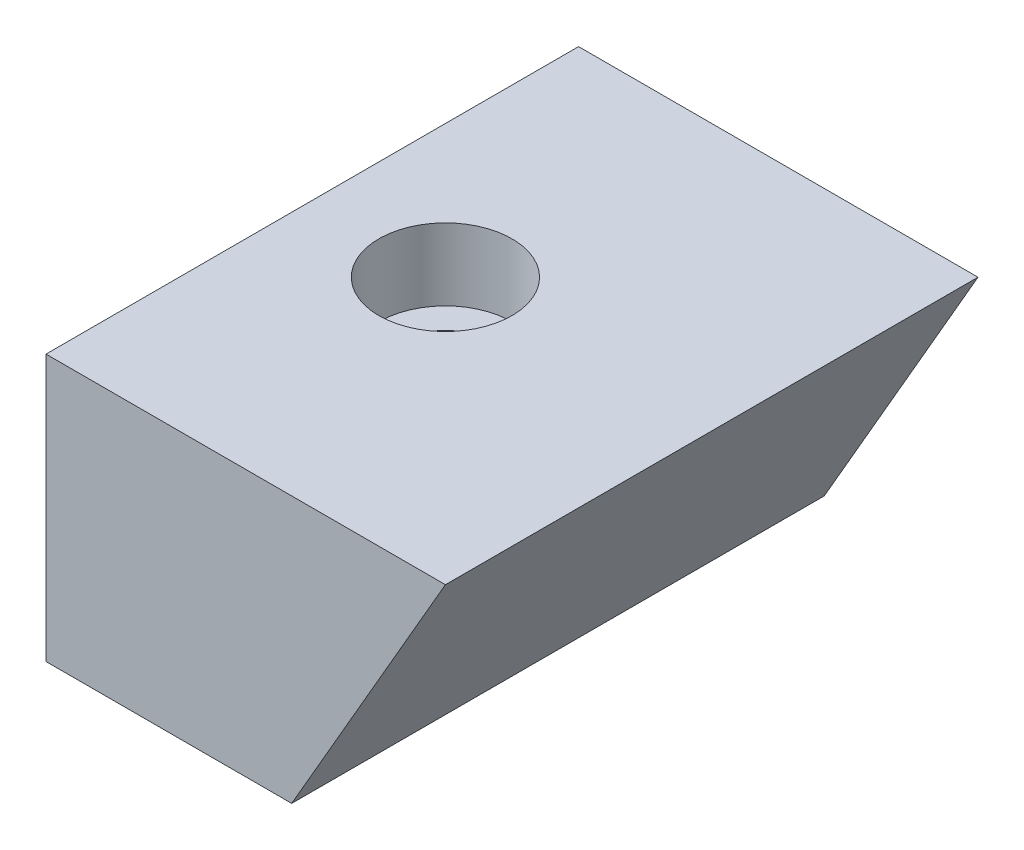
ISO-10303-21;
HEADER;
FILE_DESCRIPTION(('STEP AP214'),'2;1');
FILE_NAME('part.step','',(''),(''),'','','');
FILE_SCHEMA(('AUTOMOTIVE_DESIGN { 1 0 10303 214 1 1 1 1 }'));
ENDSEC;
DATA;
#1=APPLICATION_CONTEXT('core data for automotive mechanical design processes');
#2=APPLICATION_PROTOCOL_DEFINITION('international standard','automotive_design',2000,#1);
#3=PRODUCT_CONTEXT('',#1,'mechanical');
#4=PRODUCT('Part','Part','',(#3));
#5=PRODUCT_RELATED_PRODUCT_CATEGORY('part','',(#4));
#6=PRODUCT_DEFINITION_FORMATION('','',#4);
#7=PRODUCT_DEFINITION_CONTEXT('part definition',#1,'design');
#8=PRODUCT_DEFINITION('design','',#6,#7);
#9=PRODUCT_DEFINITION_SHAPE('','',#8);
#10=(LENGTH_UNIT() NAMED_UNIT(*) SI_UNIT(.MILLI.,.METRE.));
#11=(NAMED_UNIT(*) PLANE_ANGLE_UNIT() SI_UNIT($,.RADIAN.));
#12=(NAMED_UNIT(*) SI_UNIT($,.STERADIAN.) SOLID_ANGLE_UNIT());
#13=UNCERTAINTY_MEASURE_WITH_UNIT(LENGTH_MEASURE(1.E-05),#10,'distance_accuracy_value','');
#14=(GEOMETRIC_REPRESENTATION_CONTEXT(3) GLOBAL_UNCERTAINTY_ASSIGNED_CONTEXT((#13)) GLOBAL_UNIT_ASSIGNED_CONTEXT((#10,
#11,#12)) REPRESENTATION_CONTEXT('',''));
#15=CARTESIAN_POINT('',(0.,0.,0.));
#16=DIRECTION('',(0.,0.,1.));
#17=DIRECTION('',(1.,0.,0.));
#18=AXIS2_PLACEMENT_3D('',#15,#16,#17);
#19=CARTESIAN_POINT('',(-10.0000000000117,20.6911673232573,40.));
#20=DIRECTION('',(1.,0.,0.));
#21=DIRECTION('',(0.,0.,-1.));
#22=AXIS2_PLACEMENT_3D('',#19,#20,#21);
#23=PLANE('',#22);
#24=DIRECTION('',(0.,-1.,0.));
#25=VECTOR('',#24,1.);
#26=CARTESIAN_POINT('',(-10.0000000000117,20.6911673232573,0.));
#27=LINE('',#26,#25);
#28=CARTESIAN_POINT('',(-10.0000000000117,20.6911673232573,0.));
#29=VERTEX_POINT('',#28);
#30=CARTESIAN_POINT('',(-10.0000000000117,0.691167323257264,0.));
#31=VERTEX_POINT('',#30);
#32=EDGE_CURVE('E95',#29,#31,#27,.T.);
#33=ORIENTED_EDGE('',*,*,#32,.T.);
#34=DIRECTION('',(0.,0.,-1.));
#35=VECTOR('',#34,1.);
#36=CARTESIAN_POINT('',(-10.0000000000117,0.691167323257264,40.));
#37=LINE('',#36,#35);
#38=CARTESIAN_POINT('',(-10.0000000000117,0.691167323257264,40.));
#39=VERTEX_POINT('',#38);
#40=EDGE_CURVE('E11',#39,#31,#37,.T.);
#41=ORIENTED_EDGE('',*,*,#40,.F.);
#42=DIRECTION('',(0.,-1.,0.));
#43=VECTOR('',#42,1.);
#44=CARTESIAN_POINT('',(-10.0000000000117,20.6911673232573,40.));
#45=LINE('',#44,#43);
#46=CARTESIAN_POINT('',(-10.0000000000117,20.6911673232573,40.));
#47=VERTEX_POINT('',#46);
#48=EDGE_CURVE('E83',#47,#39,#45,.T.);
#49=ORIENTED_EDGE('',*,*,#48,.F.);
#50=DIRECTION('',(0.,0.,-1.));
#51=VECTOR('',#50,1.);
#52=CARTESIAN_POINT('',(-10.0000000000117,20.6911673232573,40.));
#53=LINE('',#52,#51);
#54=EDGE_CURVE('E91',#47,#29,#53,.T.);
#55=ORIENTED_EDGE('',*,*,#54,.T.);
#56=EDGE_LOOP('',(#33,#41,#49,#55));
#57=FACE_BOUND('',#56,.T.);
#58=ADVANCED_FACE('F32',(#57),#23,.F.);
#59=CARTESIAN_POINT('',(-10.0000000000117,0.691167323257264,40.));
#60=DIRECTION('',(0.,1.,0.));
#61=DIRECTION('',(-1.,0.,0.));
#62=AXIS2_PLACEMENT_3D('',#59,#60,#61);
#63=PLANE('',#62);
#64=CARTESIAN_POINT('',(-1.16579199997228E-11,0.691167323257261,20.));
#65=DIRECTION('',(0.,1.,0.));
#66=DIRECTION('',(0.,0.,1.));
#67=AXIS2_PLACEMENT_3D('',#64,#65,#66);
#68=CIRCLE('',#67,2.75);
#69=CARTESIAN_POINT('',(-1.16579199997228E-11,0.691167323257261,22.75));
#70=VERTEX_POINT('',#69);
#71=EDGE_CURVE('E98',#70,#70,#68,.T.);
#72=ORIENTED_EDGE('',*,*,#71,.T.);
#73=EDGE_LOOP('',(#72));
#74=FACE_BOUND('',#73,.T.);
#75=DIRECTION('',(1.,0.,0.));
#76=VECTOR('',#75,1.);
#77=CARTESIAN_POINT('',(-10.0000000000117,0.691167323257264,0.));
#78=LINE('',#77,#76);
#79=CARTESIAN_POINT('',(8.45299461619571,0.691167323257266,0.));
#80=VERTEX_POINT('',#79);
#81=EDGE_CURVE('E87',#31,#80,#78,.T.);
#82=ORIENTED_EDGE('',*,*,#81,.T.);
#83=DIRECTION('',(0.,0.,-1.));
#84=VECTOR('',#83,1.);
#85=CARTESIAN_POINT('',(8.45299461619571,0.691167323257266,40.));
#86=LINE('',#85,#84);
#87=CARTESIAN_POINT('',(8.45299461619571,0.691167323257266,40.));
#88=VERTEX_POINT('',#87);
#89=EDGE_CURVE('E40',#88,#80,#86,.T.);
#90=ORIENTED_EDGE('',*,*,#89,.F.);
#91=DIRECTION('',(1.,0.,0.));
#92=VECTOR('',#91,1.);
#93=CARTESIAN_POINT('',(-10.0000000000117,0.691167323257264,40.));
#94=LINE('',#93,#92);
#95=EDGE_CURVE('E78',#39,#88,#94,.T.);
#96=ORIENTED_EDGE('',*,*,#95,.F.);
#97=ORIENTED_EDGE('',*,*,#40,.T.);
#98=EDGE_LOOP('',(#82,#90,#96,#97));
#99=FACE_BOUND('',#98,.T.);
#100=ADVANCED_FACE('F86',(#74,#99),#63,.F.);
#101=CARTESIAN_POINT('',(8.45299461619571,0.691167323257266,40.));
#102=DIRECTION('',(-0.866025403784436,0.500000000000004,0.));
#103=DIRECTION('',(-0.500000000000004,-0.866025403784436,0.));
#104=AXIS2_PLACEMENT_3D('',#101,#102,#103);
#105=PLANE('',#104);
#106=DIRECTION('',(0.500000000000004,0.866025403784436,0.));
#107=VECTOR('',#106,1.);
#108=CARTESIAN_POINT('',(8.45299461619571,0.691167323257266,0.));
#109=LINE('',#108,#107);
#110=CARTESIAN_POINT('',(19.9999999999883,20.6911673232573,0.));
#111=VERTEX_POINT('',#110);
#112=EDGE_CURVE('E65',#80,#111,#109,.T.);
#113=ORIENTED_EDGE('',*,*,#112,.T.);
#114=DIRECTION('',(0.,0.,-1.));
#115=VECTOR('',#114,1.);
#116=CARTESIAN_POINT('',(19.9999999999883,20.6911673232573,40.));
#117=LINE('',#116,#115);
#118=CARTESIAN_POINT('',(19.9999999999883,20.6911673232573,40.));
#119=VERTEX_POINT('',#118);
#120=EDGE_CURVE('E88',#119,#111,#117,.T.);
#121=ORIENTED_EDGE('',*,*,#120,.F.);
#122=DIRECTION('',(0.500000000000004,0.866025403784436,0.));
#123=VECTOR('',#122,1.);
#124=CARTESIAN_POINT('',(8.45299461619571,0.691167323257266,40.));
#125=LINE('',#124,#123);
#126=EDGE_CURVE('E81',#88,#119,#125,.T.);
#127=ORIENTED_EDGE('',*,*,#126,.F.);
#128=ORIENTED_EDGE('',*,*,#89,.T.);
#129=EDGE_LOOP('',(#113,#121,#127,#128));
#130=FACE_BOUND('',#129,.T.);
#131=ADVANCED_FACE('F89',(#130),#105,.F.);
#132=CARTESIAN_POINT('',(19.9999999999883,20.6911673232573,40.));
#133=DIRECTION('',(0.,-1.,0.));
#134=DIRECTION('',(1.,0.,0.));
#135=AXIS2_PLACEMENT_3D('',#132,#133,#134);
#136=PLANE('',#135);
#137=CARTESIAN_POINT('',(-1.16579199997228E-11,20.6911673232573,20.));
#138=DIRECTION('',(0.,1.,0.));
#139=DIRECTION('',(0.,0.,1.));
#140=AXIS2_PLACEMENT_3D('',#137,#138,#139);
#141=CIRCLE('',#140,5.);
#142=CARTESIAN_POINT('',(-1.16579199997228E-11,20.6911673232573,25.));
#143=VERTEX_POINT('',#142);
#144=EDGE_CURVE('E117',#143,#143,#141,.T.);
#145=ORIENTED_EDGE('',*,*,#144,.F.);
#146=EDGE_LOOP('',(#145));
#147=FACE_BOUND('',#146,.T.);
#148=DIRECTION('',(-1.,0.,0.));
#149=VECTOR('',#148,1.);
#150=CARTESIAN_POINT('',(19.9999999999883,20.6911673232573,0.));
#151=LINE('',#150,#149);
#152=EDGE_CURVE('E71',#111,#29,#151,.T.);
#153=ORIENTED_EDGE('',*,*,#152,.T.);
#154=ORIENTED_EDGE('',*,*,#54,.F.);
#155=DIRECTION('',(-1.,0.,0.));
#156=VECTOR('',#155,1.);
#157=CARTESIAN_POINT('',(19.9999999999883,20.6911673232573,40.));
#158=LINE('',#157,#156);
#159=EDGE_CURVE('E48',#119,#47,#158,.T.);
#160=ORIENTED_EDGE('',*,*,#159,.F.);
#161=ORIENTED_EDGE('',*,*,#120,.T.);
#162=EDGE_LOOP('',(#153,#154,#160,#161));
#163=FACE_BOUND('',#162,.T.);
#164=ADVANCED_FACE('F103',(#147,#163),#136,.F.);
#165=CARTESIAN_POINT('',(0.,0.,40.));
#166=DIRECTION('',(0.,0.,1.));
#167=DIRECTION('',(1.,0.,0.));
#168=AXIS2_PLACEMENT_3D('',#165,#166,#167);
#169=PLANE('',#168);
#170=ORIENTED_EDGE('',*,*,#48,.T.);
#171=ORIENTED_EDGE('',*,*,#95,.T.);
#172=ORIENTED_EDGE('',*,*,#126,.T.);
#173=ORIENTED_EDGE('',*,*,#159,.T.);
#174=EDGE_LOOP('',(#170,#171,#172,#173));
#175=FACE_BOUND('',#174,.T.);
#176=ADVANCED_FACE('F79',(#175),#169,.T.);
#177=CARTESIAN_POINT('',(0.,0.,0.));
#178=DIRECTION('',(0.,0.,1.));
#179=DIRECTION('',(1.,0.,0.));
#180=AXIS2_PLACEMENT_3D('',#177,#178,#179);
#181=PLANE('',#180);
#182=ORIENTED_EDGE('',*,*,#32,.F.);
#183=ORIENTED_EDGE('',*,*,#152,.F.);
#184=ORIENTED_EDGE('',*,*,#112,.F.);
#185=ORIENTED_EDGE('',*,*,#81,.F.);
#186=EDGE_LOOP('',(#182,#183,#184,#185));
#187=FACE_BOUND('',#186,.T.);
#188=ADVANCED_FACE('F106',(#187),#181,.F.);
#189=CARTESIAN_POINT('',(-1.16579199997228E-11,20.6911673232573,20.));
#190=DIRECTION('',(0.,1.,0.));
#191=DIRECTION('',(0.,0.,1.));
#192=AXIS2_PLACEMENT_3D('',#189,#190,#191);
#193=CYLINDRICAL_SURFACE('',#192,2.75);
#194=ORIENTED_EDGE('',*,*,#71,.F.);
#195=EDGE_LOOP('',(#194));
#196=FACE_BOUND('',#195,.T.);
#197=CARTESIAN_POINT('',(-1.16579199997228E-11,15.2911673232573,20.));
#198=DIRECTION('',(0.,1.,0.));
#199=DIRECTION('',(0.,0.,1.));
#200=AXIS2_PLACEMENT_3D('',#197,#198,#199);
#201=CIRCLE('',#200,2.75);
#202=CARTESIAN_POINT('',(-1.16579199997228E-11,15.2911673232573,22.75));
#203=VERTEX_POINT('',#202);
#204=EDGE_CURVE('E111',#203,#203,#201,.T.);
#205=ORIENTED_EDGE('',*,*,#204,.T.);
#206=EDGE_LOOP('',(#205));
#207=FACE_BOUND('',#206,.T.);
#208=ADVANCED_FACE('F141',(#196,#207),#193,.F.);
#209=CARTESIAN_POINT('',(2.74999999998834,15.2911673232573,20.));
#210=DIRECTION('',(0.,-1.,0.));
#211=DIRECTION('',(0.,0.,-1.));
#212=AXIS2_PLACEMENT_3D('',#209,#210,#211);
#213=PLANE('',#212);
#214=ORIENTED_EDGE('',*,*,#204,.F.);
#215=EDGE_LOOP('',(#214));
#216=FACE_BOUND('',#215,.T.);
#217=CARTESIAN_POINT('',(-1.16579199997228E-11,15.2911673232573,20.));
#218=DIRECTION('',(0.,1.,0.));
#219=DIRECTION('',(0.,0.,1.));
#220=AXIS2_PLACEMENT_3D('',#217,#218,#219);
#221=CIRCLE('',#220,5.);
#222=CARTESIAN_POINT('',(-1.16579199997228E-11,15.2911673232573,25.));
#223=VERTEX_POINT('',#222);
#224=EDGE_CURVE('E114',#223,#223,#221,.T.);
#225=ORIENTED_EDGE('',*,*,#224,.T.);
#226=EDGE_LOOP('',(#225));
#227=FACE_BOUND('',#226,.T.);
#228=ADVANCED_FACE('F144',(#216,#227),#213,.F.);
#229=CARTESIAN_POINT('',(-1.16579199997228E-11,20.6911673232573,20.));
#230=DIRECTION('',(0.,1.,0.));
#231=DIRECTION('',(0.,0.,1.));
#232=AXIS2_PLACEMENT_3D('',#229,#230,#231);
#233=CYLINDRICAL_SURFACE('',#232,5.);
#234=ORIENTED_EDGE('',*,*,#224,.F.);
#235=EDGE_LOOP('',(#234));
#236=FACE_BOUND('',#235,.T.);
#237=ORIENTED_EDGE('',*,*,#144,.T.);
#238=EDGE_LOOP('',(#237));
#239=FACE_BOUND('',#238,.T.);
#240=ADVANCED_FACE('F121',(#236,#239),#233,.F.);
#241=CLOSED_SHELL('',(#58,#100,#131,#164,#176,#188,#208,#228,#240));
#242=MANIFOLD_SOLID_BREP('B2',#241);
#243=ADVANCED_BREP_SHAPE_REPRESENTATION('',(#18,#242),#14);
#244=SHAPE_DEFINITION_REPRESENTATION(#9,#243);
ENDSEC;
END-ISO-10303-21;
